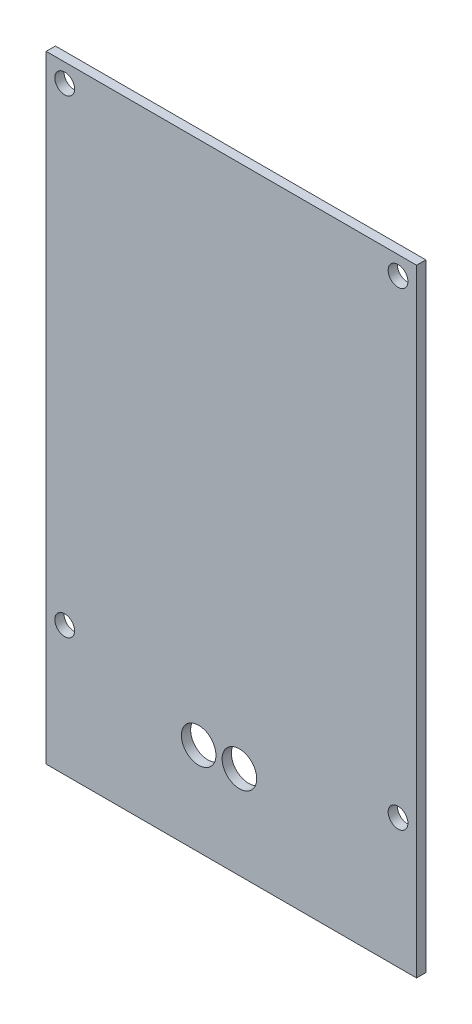
ISO-10303-21;
HEADER;
FILE_DESCRIPTION(('STEP AP214'),'2;1');
FILE_NAME('part.step','',(''),(''),'','','');
FILE_SCHEMA(('AUTOMOTIVE_DESIGN { 1 0 10303 214 1 1 1 1 }'));
ENDSEC;
DATA;
#1=APPLICATION_CONTEXT('core data for automotive mechanical design processes');
#2=APPLICATION_PROTOCOL_DEFINITION('international standard','automotive_design',2000,#1);
#3=PRODUCT_CONTEXT('',#1,'mechanical');
#4=PRODUCT('Part','Part','',(#3));
#5=PRODUCT_RELATED_PRODUCT_CATEGORY('part','',(#4));
#6=PRODUCT_DEFINITION_FORMATION('','',#4);
#7=PRODUCT_DEFINITION_CONTEXT('part definition',#1,'design');
#8=PRODUCT_DEFINITION('design','',#6,#7);
#9=PRODUCT_DEFINITION_SHAPE('','',#8);
#10=(LENGTH_UNIT() NAMED_UNIT(*) SI_UNIT(.MILLI.,.METRE.));
#11=(NAMED_UNIT(*) PLANE_ANGLE_UNIT() SI_UNIT($,.RADIAN.));
#12=(NAMED_UNIT(*) SI_UNIT($,.STERADIAN.) SOLID_ANGLE_UNIT());
#13=UNCERTAINTY_MEASURE_WITH_UNIT(LENGTH_MEASURE(1.E-05),#10,'distance_accuracy_value','');
#14=(GEOMETRIC_REPRESENTATION_CONTEXT(3) GLOBAL_UNCERTAINTY_ASSIGNED_CONTEXT((#13)) GLOBAL_UNIT_ASSIGNED_CONTEXT((#10,
#11,#12)) REPRESENTATION_CONTEXT('',''));
#15=CARTESIAN_POINT('',(0.,0.,0.));
#16=DIRECTION('',(0.,0.,1.));
#17=DIRECTION('',(1.,0.,0.));
#18=AXIS2_PLACEMENT_3D('',#15,#16,#17);
#19=CARTESIAN_POINT('',(0.,0.,1.5));
#20=DIRECTION('',(0.,0.,-1.));
#21=DIRECTION('',(-1.,0.,0.));
#22=AXIS2_PLACEMENT_3D('',#19,#20,#21);
#23=PLANE('',#22);
#24=DIRECTION('',(-1.,0.,0.));
#25=VECTOR('',#24,1.);
#26=CARTESIAN_POINT('',(-30.,78.4470209541126,1.5));
#27=LINE('',#26,#25);
#28=CARTESIAN_POINT('',(30.,78.4470209541126,1.5));
#29=VERTEX_POINT('',#28);
#30=CARTESIAN_POINT('',(-30.,78.4470209541126,1.5));
#31=VERTEX_POINT('',#30);
#32=EDGE_CURVE('E92',#29,#31,#27,.T.);
#33=ORIENTED_EDGE('',*,*,#32,.T.);
#34=DIRECTION('',(0.,-1.,0.));
#35=VECTOR('',#34,1.);
#36=CARTESIAN_POINT('',(-30.,-21.5529790458874,1.5));
#37=LINE('',#36,#35);
#38=CARTESIAN_POINT('',(-30.,-21.5529790458874,1.5));
#39=VERTEX_POINT('',#38);
#40=EDGE_CURVE('E87',#31,#39,#37,.T.);
#41=ORIENTED_EDGE('',*,*,#40,.T.);
#42=DIRECTION('',(1.,0.,0.));
#43=VECTOR('',#42,1.);
#44=CARTESIAN_POINT('',(30.,-21.5529790458874,1.5));
#45=LINE('',#44,#43);
#46=CARTESIAN_POINT('',(30.,-21.5529790458874,1.5));
#47=VERTEX_POINT('',#46);
#48=EDGE_CURVE('E90',#39,#47,#45,.T.);
#49=ORIENTED_EDGE('',*,*,#48,.T.);
#50=DIRECTION('',(0.,1.,0.));
#51=VECTOR('',#50,1.);
#52=CARTESIAN_POINT('',(30.,78.4470209541126,1.5));
#53=LINE('',#52,#51);
#54=EDGE_CURVE('E57',#47,#29,#53,.T.);
#55=ORIENTED_EDGE('',*,*,#54,.T.);
#56=EDGE_LOOP('',(#33,#41,#49,#55));
#57=FACE_BOUND('',#56,.T.);
#58=CARTESIAN_POINT('',(-5.3,-6.55297904588738,1.5));
#59=DIRECTION('',(0.,0.,1.));
#60=DIRECTION('',(1.,0.,0.));
#61=AXIS2_PLACEMENT_3D('',#58,#59,#60);
#62=CIRCLE('',#61,2.8);
#63=CARTESIAN_POINT('',(-2.5,-6.55297904588738,1.5));
#64=VERTEX_POINT('',#63);
#65=EDGE_CURVE('E112',#64,#64,#62,.T.);
#66=ORIENTED_EDGE('',*,*,#65,.F.);
#67=EDGE_LOOP('',(#66));
#68=FACE_BOUND('',#67,.T.);
#69=CARTESIAN_POINT('',(-27.,-0.552979045887376,1.5));
#70=DIRECTION('',(0.,0.,1.));
#71=DIRECTION('',(1.,0.,0.));
#72=AXIS2_PLACEMENT_3D('',#69,#70,#71);
#73=CIRCLE('',#72,1.60000000000001);
#74=CARTESIAN_POINT('',(-25.4,-0.552979045887376,1.5));
#75=VERTEX_POINT('',#74);
#76=EDGE_CURVE('E134',#75,#75,#73,.T.);
#77=ORIENTED_EDGE('',*,*,#76,.F.);
#78=EDGE_LOOP('',(#77));
#79=FACE_BOUND('',#78,.T.);
#80=CARTESIAN_POINT('',(27.,75.4470209541126,1.5));
#81=DIRECTION('',(0.,0.,1.));
#82=DIRECTION('',(1.,0.,0.));
#83=AXIS2_PLACEMENT_3D('',#80,#81,#82);
#84=CIRCLE('',#83,1.60000000000001);
#85=CARTESIAN_POINT('',(28.6,75.4470209541126,1.5));
#86=VERTEX_POINT('',#85);
#87=EDGE_CURVE('E142',#86,#86,#84,.T.);
#88=ORIENTED_EDGE('',*,*,#87,.F.);
#89=EDGE_LOOP('',(#88));
#90=FACE_BOUND('',#89,.T.);
#91=CARTESIAN_POINT('',(-27.,75.4470209541126,1.5));
#92=DIRECTION('',(0.,0.,1.));
#93=DIRECTION('',(1.,0.,0.));
#94=AXIS2_PLACEMENT_3D('',#91,#92,#93);
#95=CIRCLE('',#94,1.60000000000001);
#96=CARTESIAN_POINT('',(-25.4,75.4470209541126,1.5));
#97=VERTEX_POINT('',#96);
#98=EDGE_CURVE('E150',#97,#97,#95,.T.);
#99=ORIENTED_EDGE('',*,*,#98,.F.);
#100=EDGE_LOOP('',(#99));
#101=FACE_BOUND('',#100,.T.);
#102=CARTESIAN_POINT('',(27.,-0.552979045887376,1.5));
#103=DIRECTION('',(0.,0.,1.));
#104=DIRECTION('',(1.,0.,0.));
#105=AXIS2_PLACEMENT_3D('',#102,#103,#104);
#106=CIRCLE('',#105,1.6);
#107=CARTESIAN_POINT('',(28.6,-0.552979045887376,1.5));
#108=VERTEX_POINT('',#107);
#109=EDGE_CURVE('E158',#108,#108,#106,.T.);
#110=ORIENTED_EDGE('',*,*,#109,.F.);
#111=EDGE_LOOP('',(#110));
#112=FACE_BOUND('',#111,.T.);
#113=CARTESIAN_POINT('',(1.3,-6.55297904588738,1.5));
#114=DIRECTION('',(0.,0.,1.));
#115=DIRECTION('',(1.,0.,0.));
#116=AXIS2_PLACEMENT_3D('',#113,#114,#115);
#117=CIRCLE('',#116,2.8);
#118=CARTESIAN_POINT('',(4.1,-6.55297904588738,1.5));
#119=VERTEX_POINT('',#118);
#120=EDGE_CURVE('E166',#119,#119,#117,.T.);
#121=ORIENTED_EDGE('',*,*,#120,.F.);
#122=EDGE_LOOP('',(#121));
#123=FACE_BOUND('',#122,.T.);
#124=ADVANCED_FACE('F39',(#57,#68,#79,#90,#101,#112,#123),#23,.F.);
#125=CARTESIAN_POINT('',(0.,0.,0.));
#126=DIRECTION('',(0.,0.,-1.));
#127=DIRECTION('',(-1.,0.,0.));
#128=AXIS2_PLACEMENT_3D('',#125,#126,#127);
#129=PLANE('',#128);
#130=CARTESIAN_POINT('',(27.,-0.552979045887376,0.));
#131=DIRECTION('',(0.,0.,1.));
#132=DIRECTION('',(1.,0.,0.));
#133=AXIS2_PLACEMENT_3D('',#130,#131,#132);
#134=CIRCLE('',#133,1.6);
#135=CARTESIAN_POINT('',(28.6,-0.552979045887376,0.));
#136=VERTEX_POINT('',#135);
#137=EDGE_CURVE('E162',#136,#136,#134,.T.);
#138=ORIENTED_EDGE('',*,*,#137,.T.);
#139=EDGE_LOOP('',(#138));
#140=FACE_BOUND('',#139,.T.);
#141=CARTESIAN_POINT('',(27.,75.4470209541126,0.));
#142=DIRECTION('',(0.,0.,1.));
#143=DIRECTION('',(1.,0.,0.));
#144=AXIS2_PLACEMENT_3D('',#141,#142,#143);
#145=CIRCLE('',#144,1.60000000000001);
#146=CARTESIAN_POINT('',(28.6,75.4470209541126,0.));
#147=VERTEX_POINT('',#146);
#148=EDGE_CURVE('E146',#147,#147,#145,.T.);
#149=ORIENTED_EDGE('',*,*,#148,.T.);
#150=EDGE_LOOP('',(#149));
#151=FACE_BOUND('',#150,.T.);
#152=CARTESIAN_POINT('',(-5.3,-6.55297904588738,0.));
#153=DIRECTION('',(0.,0.,1.));
#154=DIRECTION('',(1.,0.,0.));
#155=AXIS2_PLACEMENT_3D('',#152,#153,#154);
#156=CIRCLE('',#155,2.8);
#157=CARTESIAN_POINT('',(-2.5,-6.55297904588738,0.));
#158=VERTEX_POINT('',#157);
#159=EDGE_CURVE('E130',#158,#158,#156,.T.);
#160=ORIENTED_EDGE('',*,*,#159,.T.);
#161=EDGE_LOOP('',(#160));
#162=FACE_BOUND('',#161,.T.);
#163=DIRECTION('',(-1.,0.,0.));
#164=VECTOR('',#163,1.);
#165=CARTESIAN_POINT('',(-30.,78.4470209541126,0.));
#166=LINE('',#165,#164);
#167=CARTESIAN_POINT('',(30.,78.4470209541126,0.));
#168=VERTEX_POINT('',#167);
#169=CARTESIAN_POINT('',(-30.,78.4470209541126,0.));
#170=VERTEX_POINT('',#169);
#171=EDGE_CURVE('E108',#168,#170,#166,.T.);
#172=ORIENTED_EDGE('',*,*,#171,.F.);
#173=DIRECTION('',(0.,1.,0.));
#174=VECTOR('',#173,1.);
#175=CARTESIAN_POINT('',(30.,78.4470209541126,0.));
#176=LINE('',#175,#174);
#177=CARTESIAN_POINT('',(30.,-21.5529790458874,0.));
#178=VERTEX_POINT('',#177);
#179=EDGE_CURVE('E80',#178,#168,#176,.T.);
#180=ORIENTED_EDGE('',*,*,#179,.F.);
#181=DIRECTION('',(1.,0.,0.));
#182=VECTOR('',#181,1.);
#183=CARTESIAN_POINT('',(30.,-21.5529790458874,0.));
#184=LINE('',#183,#182);
#185=CARTESIAN_POINT('',(-30.,-21.5529790458874,0.));
#186=VERTEX_POINT('',#185);
#187=EDGE_CURVE('E74',#186,#178,#184,.T.);
#188=ORIENTED_EDGE('',*,*,#187,.F.);
#189=DIRECTION('',(0.,-1.,0.));
#190=VECTOR('',#189,1.);
#191=CARTESIAN_POINT('',(-30.,-21.5529790458874,0.));
#192=LINE('',#191,#190);
#193=EDGE_CURVE('E97',#170,#186,#192,.T.);
#194=ORIENTED_EDGE('',*,*,#193,.F.);
#195=EDGE_LOOP('',(#172,#180,#188,#194));
#196=FACE_BOUND('',#195,.T.);
#197=CARTESIAN_POINT('',(-27.,-0.552979045887376,0.));
#198=DIRECTION('',(0.,0.,1.));
#199=DIRECTION('',(1.,0.,0.));
#200=AXIS2_PLACEMENT_3D('',#197,#198,#199);
#201=CIRCLE('',#200,1.60000000000001);
#202=CARTESIAN_POINT('',(-25.4,-0.552979045887376,0.));
#203=VERTEX_POINT('',#202);
#204=EDGE_CURVE('E138',#203,#203,#201,.T.);
#205=ORIENTED_EDGE('',*,*,#204,.T.);
#206=EDGE_LOOP('',(#205));
#207=FACE_BOUND('',#206,.T.);
#208=CARTESIAN_POINT('',(-27.,75.4470209541126,0.));
#209=DIRECTION('',(0.,0.,1.));
#210=DIRECTION('',(1.,0.,0.));
#211=AXIS2_PLACEMENT_3D('',#208,#209,#210);
#212=CIRCLE('',#211,1.60000000000001);
#213=CARTESIAN_POINT('',(-25.4,75.4470209541126,0.));
#214=VERTEX_POINT('',#213);
#215=EDGE_CURVE('E154',#214,#214,#212,.T.);
#216=ORIENTED_EDGE('',*,*,#215,.T.);
#217=EDGE_LOOP('',(#216));
#218=FACE_BOUND('',#217,.T.);
#219=CARTESIAN_POINT('',(1.3,-6.55297904588738,0.));
#220=DIRECTION('',(0.,0.,1.));
#221=DIRECTION('',(1.,0.,0.));
#222=AXIS2_PLACEMENT_3D('',#219,#220,#221);
#223=CIRCLE('',#222,2.8);
#224=CARTESIAN_POINT('',(4.1,-6.55297904588738,0.));
#225=VERTEX_POINT('',#224);
#226=EDGE_CURVE('E170',#225,#225,#223,.T.);
#227=ORIENTED_EDGE('',*,*,#226,.T.);
#228=EDGE_LOOP('',(#227));
#229=FACE_BOUND('',#228,.T.);
#230=ADVANCED_FACE('F125',(#140,#151,#162,#196,#207,#218,#229),#129,.T.);
#231=CARTESIAN_POINT('',(-30.,78.4470209541126,1.5));
#232=DIRECTION('',(0.,-1.,0.));
#233=DIRECTION('',(0.,0.,-1.));
#234=AXIS2_PLACEMENT_3D('',#231,#232,#233);
#235=PLANE('',#234);
#236=ORIENTED_EDGE('',*,*,#171,.T.);
#237=DIRECTION('',(0.,0.,-1.));
#238=VECTOR('',#237,1.);
#239=CARTESIAN_POINT('',(-30.,78.4470209541126,1.5));
#240=LINE('',#239,#238);
#241=EDGE_CURVE('E11',#31,#170,#240,.T.);
#242=ORIENTED_EDGE('',*,*,#241,.F.);
#243=ORIENTED_EDGE('',*,*,#32,.F.);
#244=DIRECTION('',(0.,0.,-1.));
#245=VECTOR('',#244,1.);
#246=CARTESIAN_POINT('',(30.,78.4470209541126,1.5));
#247=LINE('',#246,#245);
#248=EDGE_CURVE('E104',#29,#168,#247,.T.);
#249=ORIENTED_EDGE('',*,*,#248,.T.);
#250=EDGE_LOOP('',(#236,#242,#243,#249));
#251=FACE_BOUND('',#250,.T.);
#252=ADVANCED_FACE('F41',(#251),#235,.F.);
#253=CARTESIAN_POINT('',(-30.,-21.5529790458874,1.5));
#254=DIRECTION('',(1.,0.,0.));
#255=DIRECTION('',(0.,0.,-1.));
#256=AXIS2_PLACEMENT_3D('',#253,#254,#255);
#257=PLANE('',#256);
#258=ORIENTED_EDGE('',*,*,#193,.T.);
#259=DIRECTION('',(0.,0.,-1.));
#260=VECTOR('',#259,1.);
#261=CARTESIAN_POINT('',(-30.,-21.5529790458874,1.5));
#262=LINE('',#261,#260);
#263=EDGE_CURVE('E49',#39,#186,#262,.T.);
#264=ORIENTED_EDGE('',*,*,#263,.F.);
#265=ORIENTED_EDGE('',*,*,#40,.F.);
#266=ORIENTED_EDGE('',*,*,#241,.T.);
#267=EDGE_LOOP('',(#258,#264,#265,#266));
#268=FACE_BOUND('',#267,.T.);
#269=ADVANCED_FACE('F96',(#268),#257,.F.);
#270=CARTESIAN_POINT('',(30.,-21.5529790458874,1.5));
#271=DIRECTION('',(0.,1.,0.));
#272=DIRECTION('',(0.,0.,1.));
#273=AXIS2_PLACEMENT_3D('',#270,#271,#272);
#274=PLANE('',#273);
#275=ORIENTED_EDGE('',*,*,#187,.T.);
#276=DIRECTION('',(0.,0.,-1.));
#277=VECTOR('',#276,1.);
#278=CARTESIAN_POINT('',(30.,-21.5529790458874,1.5));
#279=LINE('',#278,#277);
#280=EDGE_CURVE('E99',#47,#178,#279,.T.);
#281=ORIENTED_EDGE('',*,*,#280,.F.);
#282=ORIENTED_EDGE('',*,*,#48,.F.);
#283=ORIENTED_EDGE('',*,*,#263,.T.);
#284=EDGE_LOOP('',(#275,#281,#282,#283));
#285=FACE_BOUND('',#284,.T.);
#286=ADVANCED_FACE('F100',(#285),#274,.F.);
#287=CARTESIAN_POINT('',(30.,78.4470209541126,1.5));
#288=DIRECTION('',(-1.,0.,0.));
#289=DIRECTION('',(0.,0.,1.));
#290=AXIS2_PLACEMENT_3D('',#287,#288,#289);
#291=PLANE('',#290);
#292=ORIENTED_EDGE('',*,*,#179,.T.);
#293=ORIENTED_EDGE('',*,*,#248,.F.);
#294=ORIENTED_EDGE('',*,*,#54,.F.);
#295=ORIENTED_EDGE('',*,*,#280,.T.);
#296=EDGE_LOOP('',(#292,#293,#294,#295));
#297=FACE_BOUND('',#296,.T.);
#298=ADVANCED_FACE('F122',(#297),#291,.F.);
#299=CARTESIAN_POINT('',(-5.3,-6.55297904588738,1.5));
#300=DIRECTION('',(0.,0.,-1.));
#301=DIRECTION('',(-1.,0.,0.));
#302=AXIS2_PLACEMENT_3D('',#299,#300,#301);
#303=CYLINDRICAL_SURFACE('',#302,2.8);
#304=ORIENTED_EDGE('',*,*,#65,.T.);
#305=EDGE_LOOP('',(#304));
#306=FACE_BOUND('',#305,.T.);
#307=ORIENTED_EDGE('',*,*,#159,.F.);
#308=EDGE_LOOP('',(#307));
#309=FACE_BOUND('',#308,.T.);
#310=ADVANCED_FACE('F189',(#306,#309),#303,.F.);
#311=CARTESIAN_POINT('',(-27.,-0.552979045887376,1.5));
#312=DIRECTION('',(0.,0.,-1.));
#313=DIRECTION('',(-1.,0.,0.));
#314=AXIS2_PLACEMENT_3D('',#311,#312,#313);
#315=CYLINDRICAL_SURFACE('',#314,1.60000000000001);
#316=ORIENTED_EDGE('',*,*,#76,.T.);
#317=EDGE_LOOP('',(#316));
#318=FACE_BOUND('',#317,.T.);
#319=ORIENTED_EDGE('',*,*,#204,.F.);
#320=EDGE_LOOP('',(#319));
#321=FACE_BOUND('',#320,.T.);
#322=ADVANCED_FACE('F235',(#318,#321),#315,.F.);
#323=CARTESIAN_POINT('',(27.,75.4470209541126,1.5));
#324=DIRECTION('',(0.,0.,-1.));
#325=DIRECTION('',(-1.,0.,0.));
#326=AXIS2_PLACEMENT_3D('',#323,#324,#325);
#327=CYLINDRICAL_SURFACE('',#326,1.60000000000001);
#328=ORIENTED_EDGE('',*,*,#87,.T.);
#329=EDGE_LOOP('',(#328));
#330=FACE_BOUND('',#329,.T.);
#331=ORIENTED_EDGE('',*,*,#148,.F.);
#332=EDGE_LOOP('',(#331));
#333=FACE_BOUND('',#332,.T.);
#334=ADVANCED_FACE('F243',(#330,#333),#327,.F.);
#335=CARTESIAN_POINT('',(-27.,75.4470209541126,1.5));
#336=DIRECTION('',(0.,0.,-1.));
#337=DIRECTION('',(-1.,0.,0.));
#338=AXIS2_PLACEMENT_3D('',#335,#336,#337);
#339=CYLINDRICAL_SURFACE('',#338,1.60000000000001);
#340=ORIENTED_EDGE('',*,*,#98,.T.);
#341=EDGE_LOOP('',(#340));
#342=FACE_BOUND('',#341,.T.);
#343=ORIENTED_EDGE('',*,*,#215,.F.);
#344=EDGE_LOOP('',(#343));
#345=FACE_BOUND('',#344,.T.);
#346=ADVANCED_FACE('F251',(#342,#345),#339,.F.);
#347=CARTESIAN_POINT('',(27.,-0.552979045887376,1.5));
#348=DIRECTION('',(0.,0.,-1.));
#349=DIRECTION('',(-1.,0.,0.));
#350=AXIS2_PLACEMENT_3D('',#347,#348,#349);
#351=CYLINDRICAL_SURFACE('',#350,1.6);
#352=ORIENTED_EDGE('',*,*,#109,.T.);
#353=EDGE_LOOP('',(#352));
#354=FACE_BOUND('',#353,.T.);
#355=ORIENTED_EDGE('',*,*,#137,.F.);
#356=EDGE_LOOP('',(#355));
#357=FACE_BOUND('',#356,.T.);
#358=ADVANCED_FACE('F260',(#354,#357),#351,.F.);
#359=CARTESIAN_POINT('',(1.3,-6.55297904588738,1.5));
#360=DIRECTION('',(0.,0.,-1.));
#361=DIRECTION('',(-1.,0.,0.));
#362=AXIS2_PLACEMENT_3D('',#359,#360,#361);
#363=CYLINDRICAL_SURFACE('',#362,2.8);
#364=ORIENTED_EDGE('',*,*,#120,.T.);
#365=EDGE_LOOP('',(#364));
#366=FACE_BOUND('',#365,.T.);
#367=ORIENTED_EDGE('',*,*,#226,.F.);
#368=EDGE_LOOP('',(#367));
#369=FACE_BOUND('',#368,.T.);
#370=ADVANCED_FACE('F178',(#366,#369),#363,.F.);
#371=CLOSED_SHELL('',(#124,#230,#252,#269,#286,#298,#310,#322,#334,#346,#358,#370));
#372=MANIFOLD_SOLID_BREP('B2',#371);
#373=ADVANCED_BREP_SHAPE_REPRESENTATION('',(#18,#372),#14);
#374=SHAPE_DEFINITION_REPRESENTATION(#9,#373);
ENDSEC;
END-ISO-10303-21;
